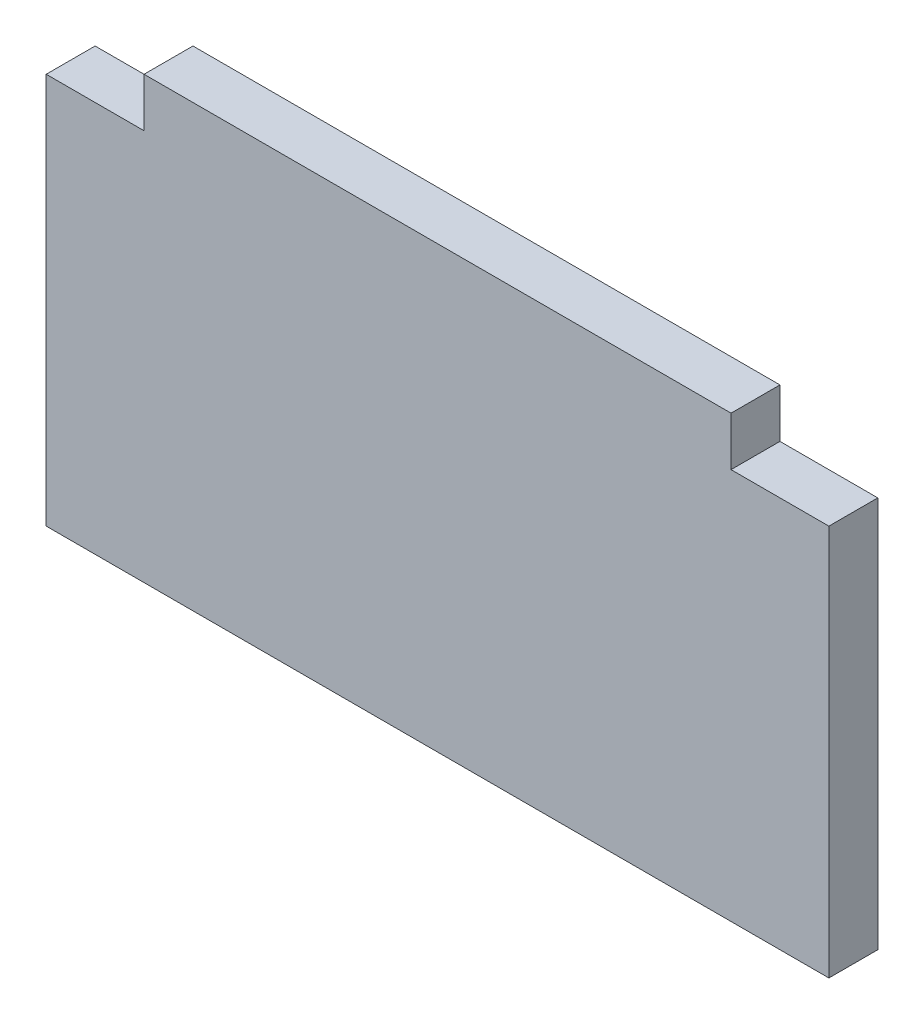
ISO-10303-21;
HEADER;
FILE_DESCRIPTION(('STEP AP214'),'2;1');
FILE_NAME('part.step','',(''),(''),'','','');
FILE_SCHEMA(('AUTOMOTIVE_DESIGN { 1 0 10303 214 1 1 1 1 }'));
ENDSEC;
DATA;
#1=APPLICATION_CONTEXT('core data for automotive mechanical design processes');
#2=APPLICATION_PROTOCOL_DEFINITION('international standard','automotive_design',2000,#1);
#3=PRODUCT_CONTEXT('',#1,'mechanical');
#4=PRODUCT('Part','Part','',(#3));
#5=PRODUCT_RELATED_PRODUCT_CATEGORY('part','',(#4));
#6=PRODUCT_DEFINITION_FORMATION('','',#4);
#7=PRODUCT_DEFINITION_CONTEXT('part definition',#1,'design');
#8=PRODUCT_DEFINITION('design','',#6,#7);
#9=PRODUCT_DEFINITION_SHAPE('','',#8);
#10=(LENGTH_UNIT() NAMED_UNIT(*) SI_UNIT(.MILLI.,.METRE.));
#11=(NAMED_UNIT(*) PLANE_ANGLE_UNIT() SI_UNIT($,.RADIAN.));
#12=(NAMED_UNIT(*) SI_UNIT($,.STERADIAN.) SOLID_ANGLE_UNIT());
#13=UNCERTAINTY_MEASURE_WITH_UNIT(LENGTH_MEASURE(1.E-05),#10,'distance_accuracy_value','');
#14=(GEOMETRIC_REPRESENTATION_CONTEXT(3) GLOBAL_UNCERTAINTY_ASSIGNED_CONTEXT((#13)) GLOBAL_UNIT_ASSIGNED_CONTEXT((#10,
#11,#12)) REPRESENTATION_CONTEXT('',''));
#15=CARTESIAN_POINT('',(0.,0.,0.));
#16=DIRECTION('',(0.,0.,1.));
#17=DIRECTION('',(1.,0.,0.));
#18=AXIS2_PLACEMENT_3D('',#15,#16,#17);
#19=CARTESIAN_POINT('',(50.8,28.575,3.175));
#20=DIRECTION('',(-1.,0.,0.));
#21=DIRECTION('',(0.,-1.,0.));
#22=AXIS2_PLACEMENT_3D('',#19,#20,#21);
#23=PLANE('',#22);
#24=DIRECTION('',(0.,0.,1.));
#25=VECTOR('',#24,1.);
#26=CARTESIAN_POINT('',(50.8,22.225,-3.175));
#27=LINE('',#26,#25);
#28=CARTESIAN_POINT('',(50.8,22.225,-3.175));
#29=VERTEX_POINT('',#28);
#30=CARTESIAN_POINT('',(50.8,22.225,3.175));
#31=VERTEX_POINT('',#30);
#32=EDGE_CURVE('E159',#29,#31,#27,.T.);
#33=ORIENTED_EDGE('',*,*,#32,.T.);
#34=DIRECTION('',(0.,1.,0.));
#35=VECTOR('',#34,1.);
#36=CARTESIAN_POINT('',(50.8,28.575,3.175));
#37=LINE('',#36,#35);
#38=CARTESIAN_POINT('',(50.8,-28.575,3.175));
#39=VERTEX_POINT('',#38);
#40=EDGE_CURVE('E132',#39,#31,#37,.T.);
#41=ORIENTED_EDGE('',*,*,#40,.F.);
#42=DIRECTION('',(0.,0.,-1.));
#43=VECTOR('',#42,1.);
#44=CARTESIAN_POINT('',(50.8,-28.575,3.175));
#45=LINE('',#44,#43);
#46=CARTESIAN_POINT('',(50.8,-28.575,-3.175));
#47=VERTEX_POINT('',#46);
#48=EDGE_CURVE('E46',#39,#47,#45,.T.);
#49=ORIENTED_EDGE('',*,*,#48,.T.);
#50=DIRECTION('',(0.,1.,0.));
#51=VECTOR('',#50,1.);
#52=CARTESIAN_POINT('',(50.8,28.575,-3.175));
#53=LINE('',#52,#51);
#54=EDGE_CURVE('E123',#47,#29,#53,.T.);
#55=ORIENTED_EDGE('',*,*,#54,.T.);
#56=EDGE_LOOP('',(#33,#41,#49,#55));
#57=FACE_BOUND('',#56,.T.);
#58=ADVANCED_FACE('F39',(#57),#23,.F.);
#59=CARTESIAN_POINT('',(-50.8,28.575,3.175));
#60=DIRECTION('',(0.,-1.,0.));
#61=DIRECTION('',(0.,0.,-1.));
#62=AXIS2_PLACEMENT_3D('',#59,#60,#61);
#63=PLANE('',#62);
#64=DIRECTION('',(0.,0.,1.));
#65=VECTOR('',#64,1.);
#66=CARTESIAN_POINT('',(38.1,28.575,-3.175));
#67=LINE('',#66,#65);
#68=CARTESIAN_POINT('',(38.1,28.575,-3.175));
#69=VERTEX_POINT('',#68);
#70=CARTESIAN_POINT('',(38.1,28.575,3.175));
#71=VERTEX_POINT('',#70);
#72=EDGE_CURVE('E105',#69,#71,#67,.T.);
#73=ORIENTED_EDGE('',*,*,#72,.F.);
#74=DIRECTION('',(-1.,0.,0.));
#75=VECTOR('',#74,1.);
#76=CARTESIAN_POINT('',(-50.8,28.575,-3.175));
#77=LINE('',#76,#75);
#78=CARTESIAN_POINT('',(-38.1,28.575,-3.175));
#79=VERTEX_POINT('',#78);
#80=EDGE_CURVE('E117',#69,#79,#77,.T.);
#81=ORIENTED_EDGE('',*,*,#80,.T.);
#82=DIRECTION('',(0.,0.,1.));
#83=VECTOR('',#82,1.);
#84=CARTESIAN_POINT('',(-38.1,28.575,-3.175));
#85=LINE('',#84,#83);
#86=CARTESIAN_POINT('',(-38.1,28.575,3.175));
#87=VERTEX_POINT('',#86);
#88=EDGE_CURVE('E128',#79,#87,#85,.T.);
#89=ORIENTED_EDGE('',*,*,#88,.T.);
#90=DIRECTION('',(-1.,0.,0.));
#91=VECTOR('',#90,1.);
#92=CARTESIAN_POINT('',(-50.8,28.575,3.175));
#93=LINE('',#92,#91);
#94=EDGE_CURVE('E118',#71,#87,#93,.T.);
#95=ORIENTED_EDGE('',*,*,#94,.F.);
#96=EDGE_LOOP('',(#73,#81,#89,#95));
#97=FACE_BOUND('',#96,.T.);
#98=ADVANCED_FACE('F115',(#97),#63,.F.);
#99=CARTESIAN_POINT('',(0.,0.,3.175));
#100=DIRECTION('',(0.,0.,1.));
#101=DIRECTION('',(1.,0.,0.));
#102=AXIS2_PLACEMENT_3D('',#99,#100,#101);
#103=PLANE('',#102);
#104=ORIENTED_EDGE('',*,*,#40,.T.);
#105=DIRECTION('',(-1.,0.,0.));
#106=VECTOR('',#105,1.);
#107=CARTESIAN_POINT('',(50.8,22.225,3.175));
#108=LINE('',#107,#106);
#109=CARTESIAN_POINT('',(38.1,22.225,3.175));
#110=VERTEX_POINT('',#109);
#111=EDGE_CURVE('E111',#31,#110,#108,.T.);
#112=ORIENTED_EDGE('',*,*,#111,.T.);
#113=DIRECTION('',(0.,1.,0.));
#114=VECTOR('',#113,1.);
#115=CARTESIAN_POINT('',(38.1,28.575,3.175));
#116=LINE('',#115,#114);
#117=EDGE_CURVE('E167',#110,#71,#116,.T.);
#118=ORIENTED_EDGE('',*,*,#117,.T.);
#119=ORIENTED_EDGE('',*,*,#94,.T.);
#120=DIRECTION('',(0.,1.,0.));
#121=VECTOR('',#120,1.);
#122=CARTESIAN_POINT('',(-38.1,28.575,3.175));
#123=LINE('',#122,#121);
#124=CARTESIAN_POINT('',(-38.1,22.225,3.175));
#125=VERTEX_POINT('',#124);
#126=EDGE_CURVE('E152',#125,#87,#123,.T.);
#127=ORIENTED_EDGE('',*,*,#126,.F.);
#128=DIRECTION('',(1.,0.,0.));
#129=VECTOR('',#128,1.);
#130=CARTESIAN_POINT('',(-50.8,22.225,3.175));
#131=LINE('',#130,#129);
#132=CARTESIAN_POINT('',(-50.8,22.225,3.175));
#133=VERTEX_POINT('',#132);
#134=EDGE_CURVE('E156',#133,#125,#131,.T.);
#135=ORIENTED_EDGE('',*,*,#134,.F.);
#136=DIRECTION('',(0.,-1.,0.));
#137=VECTOR('',#136,1.);
#138=CARTESIAN_POINT('',(-50.8,28.575,3.175));
#139=LINE('',#138,#137);
#140=CARTESIAN_POINT('',(-50.8,-28.575,3.175));
#141=VERTEX_POINT('',#140);
#142=EDGE_CURVE('E139',#133,#141,#139,.T.);
#143=ORIENTED_EDGE('',*,*,#142,.T.);
#144=DIRECTION('',(1.,0.,0.));
#145=VECTOR('',#144,1.);
#146=CARTESIAN_POINT('',(-50.8,-28.575,3.175));
#147=LINE('',#146,#145);
#148=EDGE_CURVE('E134',#141,#39,#147,.T.);
#149=ORIENTED_EDGE('',*,*,#148,.T.);
#150=EDGE_LOOP('',(#104,#112,#118,#119,#127,#135,#143,#149));
#151=FACE_BOUND('',#150,.T.);
#152=ADVANCED_FACE('F172',(#151),#103,.T.);
#153=CARTESIAN_POINT('',(0.,0.,-3.175));
#154=DIRECTION('',(0.,0.,1.));
#155=DIRECTION('',(1.,0.,0.));
#156=AXIS2_PLACEMENT_3D('',#153,#154,#155);
#157=PLANE('',#156);
#158=DIRECTION('',(-1.,0.,0.));
#159=VECTOR('',#158,1.);
#160=CARTESIAN_POINT('',(50.8,22.225,-3.175));
#161=LINE('',#160,#159);
#162=CARTESIAN_POINT('',(38.1,22.225,-3.175));
#163=VERTEX_POINT('',#162);
#164=EDGE_CURVE('E110',#29,#163,#161,.T.);
#165=ORIENTED_EDGE('',*,*,#164,.F.);
#166=ORIENTED_EDGE('',*,*,#54,.F.);
#167=DIRECTION('',(1.,0.,0.));
#168=VECTOR('',#167,1.);
#169=CARTESIAN_POINT('',(-50.8,-28.575,-3.175));
#170=LINE('',#169,#168);
#171=CARTESIAN_POINT('',(-50.8,-28.575,-3.175));
#172=VERTEX_POINT('',#171);
#173=EDGE_CURVE('E125',#172,#47,#170,.T.);
#174=ORIENTED_EDGE('',*,*,#173,.F.);
#175=DIRECTION('',(0.,-1.,0.));
#176=VECTOR('',#175,1.);
#177=CARTESIAN_POINT('',(-50.8,28.575,-3.175));
#178=LINE('',#177,#176);
#179=CARTESIAN_POINT('',(-50.8,22.225,-3.175));
#180=VERTEX_POINT('',#179);
#181=EDGE_CURVE('E122',#180,#172,#178,.T.);
#182=ORIENTED_EDGE('',*,*,#181,.F.);
#183=DIRECTION('',(1.,0.,0.));
#184=VECTOR('',#183,1.);
#185=CARTESIAN_POINT('',(-50.8,22.225,-3.175));
#186=LINE('',#185,#184);
#187=CARTESIAN_POINT('',(-38.1,22.225,-3.175));
#188=VERTEX_POINT('',#187);
#189=EDGE_CURVE('E155',#180,#188,#186,.T.);
#190=ORIENTED_EDGE('',*,*,#189,.T.);
#191=DIRECTION('',(0.,1.,0.));
#192=VECTOR('',#191,1.);
#193=CARTESIAN_POINT('',(-38.1,28.575,-3.175));
#194=LINE('',#193,#192);
#195=EDGE_CURVE('E61',#188,#79,#194,.T.);
#196=ORIENTED_EDGE('',*,*,#195,.T.);
#197=ORIENTED_EDGE('',*,*,#80,.F.);
#198=DIRECTION('',(0.,1.,0.));
#199=VECTOR('',#198,1.);
#200=CARTESIAN_POINT('',(38.1,28.575,-3.175));
#201=LINE('',#200,#199);
#202=EDGE_CURVE('E102',#163,#69,#201,.T.);
#203=ORIENTED_EDGE('',*,*,#202,.F.);
#204=EDGE_LOOP('',(#165,#166,#174,#182,#190,#196,#197,#203));
#205=FACE_BOUND('',#204,.T.);
#206=ADVANCED_FACE('F120',(#205),#157,.F.);
#207=CARTESIAN_POINT('',(-50.8,28.575,3.175));
#208=DIRECTION('',(1.,0.,0.));
#209=DIRECTION('',(0.,1.,0.));
#210=AXIS2_PLACEMENT_3D('',#207,#208,#209);
#211=PLANE('',#210);
#212=ORIENTED_EDGE('',*,*,#142,.F.);
#213=DIRECTION('',(0.,0.,1.));
#214=VECTOR('',#213,1.);
#215=CARTESIAN_POINT('',(-50.8,22.225,-3.175));
#216=LINE('',#215,#214);
#217=EDGE_CURVE('E147',#180,#133,#216,.T.);
#218=ORIENTED_EDGE('',*,*,#217,.F.);
#219=ORIENTED_EDGE('',*,*,#181,.T.);
#220=DIRECTION('',(0.,0.,-1.));
#221=VECTOR('',#220,1.);
#222=CARTESIAN_POINT('',(-50.8,-28.575,3.175));
#223=LINE('',#222,#221);
#224=EDGE_CURVE('E11',#141,#172,#223,.T.);
#225=ORIENTED_EDGE('',*,*,#224,.F.);
#226=EDGE_LOOP('',(#212,#218,#219,#225));
#227=FACE_BOUND('',#226,.T.);
#228=ADVANCED_FACE('F182',(#227),#211,.F.);
#229=CARTESIAN_POINT('',(-50.8,-28.575,3.175));
#230=DIRECTION('',(0.,1.,0.));
#231=DIRECTION('',(0.,0.,1.));
#232=AXIS2_PLACEMENT_3D('',#229,#230,#231);
#233=PLANE('',#232);
#234=ORIENTED_EDGE('',*,*,#173,.T.);
#235=ORIENTED_EDGE('',*,*,#48,.F.);
#236=ORIENTED_EDGE('',*,*,#148,.F.);
#237=ORIENTED_EDGE('',*,*,#224,.T.);
#238=EDGE_LOOP('',(#234,#235,#236,#237));
#239=FACE_BOUND('',#238,.T.);
#240=ADVANCED_FACE('F185',(#239),#233,.F.);
#241=CARTESIAN_POINT('',(-38.1,28.575,-3.175));
#242=DIRECTION('',(1.,0.,0.));
#243=DIRECTION('',(0.,0.,-1.));
#244=AXIS2_PLACEMENT_3D('',#241,#242,#243);
#245=PLANE('',#244);
#246=ORIENTED_EDGE('',*,*,#126,.T.);
#247=ORIENTED_EDGE('',*,*,#88,.F.);
#248=ORIENTED_EDGE('',*,*,#195,.F.);
#249=DIRECTION('',(0.,0.,1.));
#250=VECTOR('',#249,1.);
#251=CARTESIAN_POINT('',(-38.1,22.225,-3.175));
#252=LINE('',#251,#250);
#253=EDGE_CURVE('E149',#188,#125,#252,.T.);
#254=ORIENTED_EDGE('',*,*,#253,.T.);
#255=EDGE_LOOP('',(#246,#247,#248,#254));
#256=FACE_BOUND('',#255,.T.);
#257=ADVANCED_FACE('F175',(#256),#245,.F.);
#258=CARTESIAN_POINT('',(-50.8,22.225,-3.175));
#259=DIRECTION('',(0.,-1.,0.));
#260=DIRECTION('',(0.,0.,-1.));
#261=AXIS2_PLACEMENT_3D('',#258,#259,#260);
#262=PLANE('',#261);
#263=ORIENTED_EDGE('',*,*,#134,.T.);
#264=ORIENTED_EDGE('',*,*,#253,.F.);
#265=ORIENTED_EDGE('',*,*,#189,.F.);
#266=ORIENTED_EDGE('',*,*,#217,.T.);
#267=EDGE_LOOP('',(#263,#264,#265,#266));
#268=FACE_BOUND('',#267,.T.);
#269=ADVANCED_FACE('F177',(#268),#262,.F.);
#270=CARTESIAN_POINT('',(50.8,22.225,-3.175));
#271=DIRECTION('',(0.,1.,0.));
#272=DIRECTION('',(0.,0.,1.));
#273=AXIS2_PLACEMENT_3D('',#270,#271,#272);
#274=PLANE('',#273);
#275=ORIENTED_EDGE('',*,*,#111,.F.);
#276=ORIENTED_EDGE('',*,*,#32,.F.);
#277=ORIENTED_EDGE('',*,*,#164,.T.);
#278=DIRECTION('',(0.,0.,1.));
#279=VECTOR('',#278,1.);
#280=CARTESIAN_POINT('',(38.1,22.225,-3.175));
#281=LINE('',#280,#279);
#282=EDGE_CURVE('E53',#163,#110,#281,.T.);
#283=ORIENTED_EDGE('',*,*,#282,.T.);
#284=EDGE_LOOP('',(#275,#276,#277,#283));
#285=FACE_BOUND('',#284,.T.);
#286=ADVANCED_FACE('F170',(#285),#274,.T.);
#287=CARTESIAN_POINT('',(38.1,28.575,-3.175));
#288=DIRECTION('',(1.,0.,0.));
#289=DIRECTION('',(0.,0.,-1.));
#290=AXIS2_PLACEMENT_3D('',#287,#288,#289);
#291=PLANE('',#290);
#292=ORIENTED_EDGE('',*,*,#117,.F.);
#293=ORIENTED_EDGE('',*,*,#282,.F.);
#294=ORIENTED_EDGE('',*,*,#202,.T.);
#295=ORIENTED_EDGE('',*,*,#72,.T.);
#296=EDGE_LOOP('',(#292,#293,#294,#295));
#297=FACE_BOUND('',#296,.T.);
#298=ADVANCED_FACE('F104',(#297),#291,.T.);
#299=CLOSED_SHELL('',(#58,#98,#152,#206,#228,#240,#257,#269,#286,#298));
#300=MANIFOLD_SOLID_BREP('B2',#299);
#301=ADVANCED_BREP_SHAPE_REPRESENTATION('',(#18,#300),#14);
#302=SHAPE_DEFINITION_REPRESENTATION(#9,#301);
ENDSEC;
END-ISO-10303-21;
